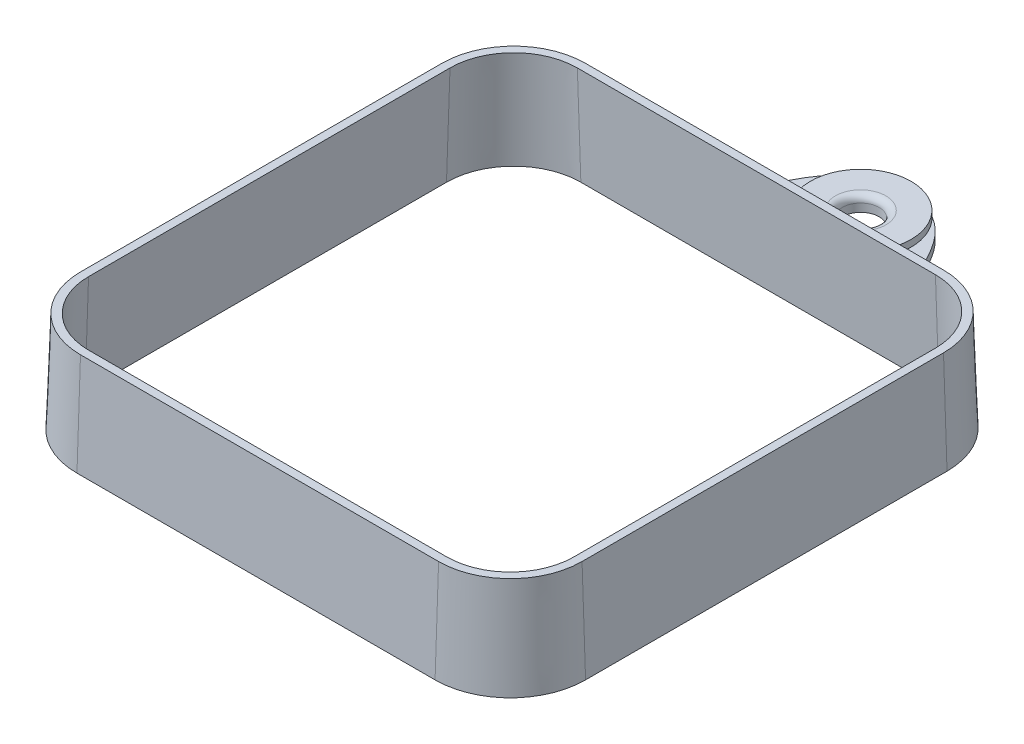
ISO-10303-21;
HEADER;
FILE_DESCRIPTION(('STEP AP214'),'2;1');
FILE_NAME('part.step','',(''),(''),'','','');
FILE_SCHEMA(('AUTOMOTIVE_DESIGN { 1 0 10303 214 1 1 1 1 }'));
ENDSEC;
DATA;
#1=APPLICATION_CONTEXT('core data for automotive mechanical design processes');
#2=APPLICATION_PROTOCOL_DEFINITION('international standard','automotive_design',2000,#1);
#3=PRODUCT_CONTEXT('',#1,'mechanical');
#4=PRODUCT('Part','Part','',(#3));
#5=PRODUCT_RELATED_PRODUCT_CATEGORY('part','',(#4));
#6=PRODUCT_DEFINITION_FORMATION('','',#4);
#7=PRODUCT_DEFINITION_CONTEXT('part definition',#1,'design');
#8=PRODUCT_DEFINITION('design','',#6,#7);
#9=PRODUCT_DEFINITION_SHAPE('','',#8);
#10=(LENGTH_UNIT() NAMED_UNIT(*) SI_UNIT(.MILLI.,.METRE.));
#11=(NAMED_UNIT(*) PLANE_ANGLE_UNIT() SI_UNIT($,.RADIAN.));
#12=(NAMED_UNIT(*) SI_UNIT($,.STERADIAN.) SOLID_ANGLE_UNIT());
#13=UNCERTAINTY_MEASURE_WITH_UNIT(LENGTH_MEASURE(1.E-05),#10,'distance_accuracy_value','');
#14=(GEOMETRIC_REPRESENTATION_CONTEXT(3) GLOBAL_UNCERTAINTY_ASSIGNED_CONTEXT((#13)) GLOBAL_UNIT_ASSIGNED_CONTEXT((#10,
#11,#12)) REPRESENTATION_CONTEXT('',''));
#15=CARTESIAN_POINT('',(0.,0.,0.));
#16=DIRECTION('',(0.,0.,1.));
#17=DIRECTION('',(1.,0.,0.));
#18=AXIS2_PLACEMENT_3D('',#15,#16,#17);
#19=CARTESIAN_POINT('',(0.,0.0418793960430013,-38.0992689924229));
#20=DIRECTION('',(0.,0.034899496702501,-0.999390827019096));
#21=DIRECTION('',(0.,0.999390827019096,0.034899496702501));
#22=AXIS2_PLACEMENT_3D('',#19,#20,#21);
#23=PLANE('',#22);
#24=CARTESIAN_POINT('',(24.3443572866646,5.06040201319,-37.9240183209204));
#25=CARTESIAN_POINT('',(24.292774527979,4.41700375723169,-37.9464862833007));
#26=CARTESIAN_POINT('',(24.2411963246733,3.77360513465057,-37.9689542582177));
#27=CARTESIAN_POINT('',(24.1380743347805,2.48680513734187,-38.0138903040675));
#28=CARTESIAN_POINT('',(24.0865305481931,1.8434037626143,-38.0363583750002));
#29=CARTESIAN_POINT('',(24.0029908254919,0.800001003921938,-38.0727948022396));
#30=CARTESIAN_POINT('',(23.9709765695924,0.400001084917427,-38.0867631072816));
#31=CARTESIAN_POINT('',(23.9389768953499,1.57888888366451E-10,-38.1007314531531));
#32=B_SPLINE_CURVE_WITH_KNOTS('',3,(#24,#25,#26,#27,#28,#29,#30,#31),.UNSPECIFIED.,.F.,.F.,(4,2,
2,4),(0.,1.9375608808805,3.87512175467341,5.07968792201789),.UNSPECIFIED.);
#33=CARTESIAN_POINT('',(24.3443572866646,5.06040201319,-37.9240183209204));
#34=VERTEX_POINT('',#33);
#35=CARTESIAN_POINT('',(23.9389768970062,0.,-38.1007314531586));
#36=VERTEX_POINT('',#35);
#37=EDGE_CURVE('E88',#34,#36,#32,.T.);
#38=ORIENTED_EDGE('',*,*,#37,.F.);
#39=DIRECTION('',(1.,0.,0.));
#40=VECTOR('',#39,1.);
#41=CARTESIAN_POINT('',(-24.035016622755,5.06040201319,-37.9240183209204));
#42=LINE('',#41,#40);
#43=CARTESIAN_POINT('',(-24.3443572866646,5.06040201319,-37.9240183209204));
#44=VERTEX_POINT('',#43);
#45=EDGE_CURVE('E290',#34,#44,#42,.F.);
#46=ORIENTED_EDGE('',*,*,#45,.T.);
#47=CARTESIAN_POINT('',(-24.3443572866646,5.06040201319,-37.9240183209204));
#48=CARTESIAN_POINT('',(-24.2927745279789,4.41700375723169,-37.9464862833007));
#49=CARTESIAN_POINT('',(-24.2411963246733,3.77360513465057,-37.9689542582177));
#50=CARTESIAN_POINT('',(-24.1380743347805,2.48680513734187,-38.0138903040675));
#51=CARTESIAN_POINT('',(-24.0865305481931,1.8434037626143,-38.0363583750002));
#52=CARTESIAN_POINT('',(-24.002990825492,0.800001003921938,-38.0727948022396));
#53=CARTESIAN_POINT('',(-23.9709765695924,0.400001084917427,-38.0867631072816));
#54=CARTESIAN_POINT('',(-23.9389768953499,1.57889464949664E-10,-38.1007314531531));
#55=B_SPLINE_CURVE_WITH_KNOTS('',3,(#47,#48,#49,#50,#51,#52,#53,#54),.UNSPECIFIED.,.F.,.F.,(4,2,
2,4),(0.,1.9375608808805,3.87512175467341,5.07968792201789),.UNSPECIFIED.);
#56=CARTESIAN_POINT('',(-23.9389768970062,0.,-38.1007314531586));
#57=VERTEX_POINT('',#56);
#58=EDGE_CURVE('E96',#44,#57,#55,.T.);
#59=ORIENTED_EDGE('',*,*,#58,.T.);
#60=DIRECTION('',(1.,0.,0.));
#61=VECTOR('',#60,1.);
#62=CARTESIAN_POINT('',(0.,0.,-38.1007314531586));
#63=LINE('',#62,#61);
#64=CARTESIAN_POINT('',(-26.65,0.,-38.1007314531586));
#65=VERTEX_POINT('',#64);
#66=EDGE_CURVE('E473',#65,#57,#63,.T.);
#67=ORIENTED_EDGE('',*,*,#66,.F.);
#68=DIRECTION('',(0.,-0.999390827019096,-0.034899496702501));
#69=VECTOR('',#68,1.);
#70=CARTESIAN_POINT('',(-26.65,0.0418793960430013,-38.0992689924229));
#71=LINE('',#70,#69);
#72=CARTESIAN_POINT('',(-26.65,15.,-37.5769199107824));
#73=VERTEX_POINT('',#72);
#74=EDGE_CURVE('E444',#73,#65,#71,.T.);
#75=ORIENTED_EDGE('',*,*,#74,.F.);
#76=DIRECTION('',(1.,0.,0.));
#77=VECTOR('',#76,1.);
#78=CARTESIAN_POINT('',(0.,15.,-37.5769199107824));
#79=LINE('',#78,#77);
#80=CARTESIAN_POINT('',(26.65,15.,-37.5769199107824));
#81=VERTEX_POINT('',#80);
#82=EDGE_CURVE('E448',#73,#81,#79,.T.);
#83=ORIENTED_EDGE('',*,*,#82,.T.);
#84=DIRECTION('',(0.,0.999390827019096,0.034899496702501));
#85=VECTOR('',#84,1.);
#86=CARTESIAN_POINT('',(26.65,0.0418793960430013,-38.0992689924229));
#87=LINE('',#86,#85);
#88=CARTESIAN_POINT('',(26.65,0.,-38.1007314531586));
#89=VERTEX_POINT('',#88);
#90=EDGE_CURVE('E447',#81,#89,#87,.F.);
#91=ORIENTED_EDGE('',*,*,#90,.T.);
#92=EDGE_CURVE('E477',#36,#89,#63,.T.);
#93=ORIENTED_EDGE('',*,*,#92,.F.);
#94=EDGE_LOOP('',(#38,#46,#59,#67,#75,#83,#91,#93));
#95=FACE_BOUND('',#94,.T.);
#96=ADVANCED_FACE('F72',(#95),#23,.T.);
#97=CARTESIAN_POINT('',(0.,15.,0.));
#98=DIRECTION('',(0.,1.,0.));
#99=DIRECTION('',(0.,0.,1.));
#100=AXIS2_PLACEMENT_3D('',#97,#98,#99);
#101=PLANE('',#100);
#102=CARTESIAN_POINT('',(-26.65,15.,-26.9));
#103=DIRECTION('',(0.,1.,0.));
#104=DIRECTION('',(0.,0.,1.));
#105=AXIS2_PLACEMENT_3D('',#102,#103,#104);
#106=CIRCLE('',#105,10.6769199107824);
#107=CARTESIAN_POINT('',(-37.3269199107824,15.,-26.9));
#108=VERTEX_POINT('',#107);
#109=EDGE_CURVE('E476',#108,#73,#106,.F.);
#110=ORIENTED_EDGE('',*,*,#109,.F.);
#111=DIRECTION('',(0.,0.,-1.));
#112=VECTOR('',#111,1.);
#113=CARTESIAN_POINT('',(-37.3269199107824,15.,0.));
#114=LINE('',#113,#112);
#115=CARTESIAN_POINT('',(-37.3269199107824,15.,26.9));
#116=VERTEX_POINT('',#115);
#117=EDGE_CURVE('E501',#116,#108,#114,.T.);
#118=ORIENTED_EDGE('',*,*,#117,.F.);
#119=CARTESIAN_POINT('',(-26.65,15.,26.9));
#120=DIRECTION('',(0.,1.,0.));
#121=DIRECTION('',(0.,0.,1.));
#122=AXIS2_PLACEMENT_3D('',#119,#120,#121);
#123=CIRCLE('',#122,10.6769199107824);
#124=CARTESIAN_POINT('',(-26.65,15.,37.5769199107824));
#125=VERTEX_POINT('',#124);
#126=EDGE_CURVE('E505',#125,#116,#123,.F.);
#127=ORIENTED_EDGE('',*,*,#126,.F.);
#128=DIRECTION('',(-1.,0.,0.));
#129=VECTOR('',#128,1.);
#130=CARTESIAN_POINT('',(0.,15.,37.5769199107824));
#131=LINE('',#130,#129);
#132=CARTESIAN_POINT('',(26.65,15.,37.5769199107824));
#133=VERTEX_POINT('',#132);
#134=EDGE_CURVE('E509',#125,#133,#131,.F.);
#135=ORIENTED_EDGE('',*,*,#134,.T.);
#136=CARTESIAN_POINT('',(26.65,15.,26.9));
#137=DIRECTION('',(0.,1.,0.));
#138=DIRECTION('',(0.,0.,1.));
#139=AXIS2_PLACEMENT_3D('',#136,#137,#138);
#140=CIRCLE('',#139,10.6769199107824);
#141=CARTESIAN_POINT('',(37.3269199107824,15.,26.9));
#142=VERTEX_POINT('',#141);
#143=EDGE_CURVE('E512',#133,#142,#140,.T.);
#144=ORIENTED_EDGE('',*,*,#143,.T.);
#145=DIRECTION('',(0.,0.,1.));
#146=VECTOR('',#145,1.);
#147=CARTESIAN_POINT('',(37.3269199107824,15.,0.));
#148=LINE('',#147,#146);
#149=CARTESIAN_POINT('',(37.3269199107824,15.,-26.9));
#150=VERTEX_POINT('',#149);
#151=EDGE_CURVE('E515',#142,#150,#148,.F.);
#152=ORIENTED_EDGE('',*,*,#151,.T.);
#153=CARTESIAN_POINT('',(26.65,15.,-26.9));
#154=DIRECTION('',(0.,1.,0.));
#155=DIRECTION('',(0.,0.,1.));
#156=AXIS2_PLACEMENT_3D('',#153,#154,#155);
#157=CIRCLE('',#156,10.6769199107824);
#158=EDGE_CURVE('E518',#150,#81,#157,.T.);
#159=ORIENTED_EDGE('',*,*,#158,.T.);
#160=ORIENTED_EDGE('',*,*,#82,.F.);
#161=EDGE_LOOP('',(#110,#118,#127,#135,#144,#152,#159,#160));
#162=FACE_BOUND('',#161,.T.);
#163=DIRECTION('',(0.,0.,-1.));
#164=VECTOR('',#163,1.);
#165=CARTESIAN_POINT('',(-36.1261884576238,15.,0.));
#166=LINE('',#165,#164);
#167=CARTESIAN_POINT('',(-36.1261884576238,15.,26.9));
#168=VERTEX_POINT('',#167);
#169=CARTESIAN_POINT('',(-36.1261884576238,15.,-26.9));
#170=VERTEX_POINT('',#169);
#171=EDGE_CURVE('E416',#168,#170,#166,.T.);
#172=ORIENTED_EDGE('',*,*,#171,.T.);
#173=CARTESIAN_POINT('',(-26.65,15.,-26.9));
#174=DIRECTION('',(0.,1.,0.));
#175=DIRECTION('',(0.,0.,1.));
#176=AXIS2_PLACEMENT_3D('',#173,#174,#175);
#177=CIRCLE('',#176,9.47618845762378);
#178=CARTESIAN_POINT('',(-26.65,15.,-36.3761884576238));
#179=VERTEX_POINT('',#178);
#180=EDGE_CURVE('E385',#170,#179,#177,.F.);
#181=ORIENTED_EDGE('',*,*,#180,.T.);
#182=DIRECTION('',(1.,0.,0.));
#183=VECTOR('',#182,1.);
#184=CARTESIAN_POINT('',(0.,15.,-36.3761884576238));
#185=LINE('',#184,#183);
#186=CARTESIAN_POINT('',(26.65,15.,-36.3761884576238));
#187=VERTEX_POINT('',#186);
#188=EDGE_CURVE('E395',#179,#187,#185,.T.);
#189=ORIENTED_EDGE('',*,*,#188,.T.);
#190=CARTESIAN_POINT('',(26.65,15.,-26.9));
#191=DIRECTION('',(0.,1.,0.));
#192=DIRECTION('',(0.,0.,1.));
#193=AXIS2_PLACEMENT_3D('',#190,#191,#192);
#194=CIRCLE('',#193,9.47618845762378);
#195=CARTESIAN_POINT('',(36.1261884576238,15.,-26.9));
#196=VERTEX_POINT('',#195);
#197=EDGE_CURVE('E433',#196,#187,#194,.T.);
#198=ORIENTED_EDGE('',*,*,#197,.F.);
#199=DIRECTION('',(0.,0.,1.));
#200=VECTOR('',#199,1.);
#201=CARTESIAN_POINT('',(36.1261884576238,15.,0.));
#202=LINE('',#201,#200);
#203=CARTESIAN_POINT('',(36.1261884576238,15.,26.9));
#204=VERTEX_POINT('',#203);
#205=EDGE_CURVE('E430',#204,#196,#202,.F.);
#206=ORIENTED_EDGE('',*,*,#205,.F.);
#207=CARTESIAN_POINT('',(26.65,15.,26.9));
#208=DIRECTION('',(0.,1.,0.));
#209=DIRECTION('',(0.,0.,1.));
#210=AXIS2_PLACEMENT_3D('',#207,#208,#209);
#211=CIRCLE('',#210,9.47618845762379);
#212=CARTESIAN_POINT('',(26.65,15.,36.3761884576238));
#213=VERTEX_POINT('',#212);
#214=EDGE_CURVE('E427',#213,#204,#211,.T.);
#215=ORIENTED_EDGE('',*,*,#214,.F.);
#216=DIRECTION('',(-1.,0.,0.));
#217=VECTOR('',#216,1.);
#218=CARTESIAN_POINT('',(0.,15.,36.3761884576238));
#219=LINE('',#218,#217);
#220=CARTESIAN_POINT('',(-26.65,15.,36.3761884576238));
#221=VERTEX_POINT('',#220);
#222=EDGE_CURVE('E424',#221,#213,#219,.F.);
#223=ORIENTED_EDGE('',*,*,#222,.F.);
#224=CARTESIAN_POINT('',(-26.65,15.,26.9));
#225=DIRECTION('',(0.,1.,0.));
#226=DIRECTION('',(0.,0.,1.));
#227=AXIS2_PLACEMENT_3D('',#224,#225,#226);
#228=CIRCLE('',#227,9.47618845762379);
#229=EDGE_CURVE('E420',#221,#168,#228,.F.);
#230=ORIENTED_EDGE('',*,*,#229,.T.);
#231=EDGE_LOOP('',(#172,#181,#189,#198,#206,#215,#223,#230));
#232=FACE_BOUND('',#231,.T.);
#233=ADVANCED_FACE('F305',(#162,#232),#101,.T.);
#234=CARTESIAN_POINT('',(0.,0.,0.));
#235=DIRECTION('',(0.,1.,0.));
#236=DIRECTION('',(0.,0.,1.));
#237=AXIS2_PLACEMENT_3D('',#234,#235,#236);
#238=PLANE('',#237);
#239=CARTESIAN_POINT('',(0.,0.,-51.9));
#240=DIRECTION('',(0.,1.,0.));
#241=DIRECTION('',(0.,0.,1.));
#242=AXIS2_PLACEMENT_3D('',#239,#240,#241);
#243=CIRCLE('',#242,2.75);
#244=CARTESIAN_POINT('',(0.,0.,-49.15));
#245=VERTEX_POINT('',#244);
#246=EDGE_CURVE('E339',#245,#245,#243,.T.);
#247=ORIENTED_EDGE('',*,*,#246,.T.);
#248=EDGE_LOOP('',(#247));
#249=FACE_BOUND('',#248,.T.);
#250=CARTESIAN_POINT('',(-5.0383215447343,0.,-57.4556562179338));
#251=CARTESIAN_POINT('',(-10.1990234495818,0.,-54.5143425507522));
#252=CARTESIAN_POINT('',(-11.6345470296447,0.,-42.5074220737766));
#253=CARTESIAN_POINT('',(-22.76873524879,0.,-38.6972857674965));
#254=CARTESIAN_POINT('',(-26.65,0.,-36.9));
#255=B_SPLINE_CURVE_WITH_KNOTS('',3,(#250,#251,#252,#253,#254),.UNSPECIFIED.,.F.,.F.,(4,1,4),
(0.,0.548123210372477,1.),.UNSPECIFIED.);
#256=CARTESIAN_POINT('',(-5.03832154473429,0.,-57.4556562179338));
#257=VERTEX_POINT('',#256);
#258=EDGE_CURVE('E255',#257,#57,#255,.T.);
#259=ORIENTED_EDGE('',*,*,#258,.F.);
#260=CARTESIAN_POINT('',(0.,0.,-51.9));
#261=DIRECTION('',(0.,1.,0.));
#262=DIRECTION('',(0.,0.,1.));
#263=AXIS2_PLACEMENT_3D('',#260,#261,#262);
#264=CIRCLE('',#263,7.5);
#265=CARTESIAN_POINT('',(5.03832154473429,0.,-57.4556562179338));
#266=VERTEX_POINT('',#265);
#267=EDGE_CURVE('E346',#266,#257,#264,.T.);
#268=ORIENTED_EDGE('',*,*,#267,.F.);
#269=CARTESIAN_POINT('',(5.0383215447343,0.,-57.4556562179338));
#270=CARTESIAN_POINT('',(10.1990234495818,0.,-54.5143425507522));
#271=CARTESIAN_POINT('',(11.6345470296447,0.,-42.5074220737765));
#272=CARTESIAN_POINT('',(22.76873524879,0.,-38.6972857674965));
#273=CARTESIAN_POINT('',(26.65,0.,-36.9));
#274=B_SPLINE_CURVE_WITH_KNOTS('',3,(#269,#270,#271,#272,#273),.UNSPECIFIED.,.F.,.F.,(4,1,4),
(0.,0.548123210372477,1.),.UNSPECIFIED.);
#275=EDGE_CURVE('E236',#266,#36,#274,.T.);
#276=ORIENTED_EDGE('',*,*,#275,.T.);
#277=ORIENTED_EDGE('',*,*,#92,.T.);
#278=CARTESIAN_POINT('',(26.65,0.,-26.9));
#279=DIRECTION('',(0.,1.,0.));
#280=DIRECTION('',(0.,0.,1.));
#281=AXIS2_PLACEMENT_3D('',#278,#279,#280);
#282=CIRCLE('',#281,11.2007314531586);
#283=CARTESIAN_POINT('',(37.8507314531586,0.,-26.9));
#284=VERTEX_POINT('',#283);
#285=EDGE_CURVE('E478',#284,#89,#282,.T.);
#286=ORIENTED_EDGE('',*,*,#285,.F.);
#287=DIRECTION('',(0.,0.,1.));
#288=VECTOR('',#287,1.);
#289=CARTESIAN_POINT('',(37.8507314531586,0.,0.));
#290=LINE('',#289,#288);
#291=CARTESIAN_POINT('',(37.8507314531586,0.,26.9));
#292=VERTEX_POINT('',#291);
#293=EDGE_CURVE('E482',#292,#284,#290,.F.);
#294=ORIENTED_EDGE('',*,*,#293,.F.);
#295=CARTESIAN_POINT('',(26.65,0.,26.9));
#296=DIRECTION('',(0.,1.,0.));
#297=DIRECTION('',(0.,0.,1.));
#298=AXIS2_PLACEMENT_3D('',#295,#296,#297);
#299=CIRCLE('',#298,11.2007314531586);
#300=CARTESIAN_POINT('',(26.65,0.,38.1007314531586));
#301=VERTEX_POINT('',#300);
#302=EDGE_CURVE('E485',#301,#292,#299,.T.);
#303=ORIENTED_EDGE('',*,*,#302,.F.);
#304=DIRECTION('',(-1.,0.,0.));
#305=VECTOR('',#304,1.);
#306=CARTESIAN_POINT('',(0.,0.,38.1007314531586));
#307=LINE('',#306,#305);
#308=CARTESIAN_POINT('',(-26.65,0.,38.1007314531586));
#309=VERTEX_POINT('',#308);
#310=EDGE_CURVE('E488',#309,#301,#307,.F.);
#311=ORIENTED_EDGE('',*,*,#310,.F.);
#312=CARTESIAN_POINT('',(-26.65,0.,26.9));
#313=DIRECTION('',(0.,1.,0.));
#314=DIRECTION('',(0.,0.,1.));
#315=AXIS2_PLACEMENT_3D('',#312,#313,#314);
#316=CIRCLE('',#315,11.2007314531586);
#317=CARTESIAN_POINT('',(-37.8507314531586,0.,26.9));
#318=VERTEX_POINT('',#317);
#319=EDGE_CURVE('E491',#309,#318,#316,.F.);
#320=ORIENTED_EDGE('',*,*,#319,.T.);
#321=DIRECTION('',(0.,0.,-1.));
#322=VECTOR('',#321,1.);
#323=CARTESIAN_POINT('',(-37.8507314531586,0.,0.));
#324=LINE('',#323,#322);
#325=CARTESIAN_POINT('',(-37.8507314531586,0.,-26.9));
#326=VERTEX_POINT('',#325);
#327=EDGE_CURVE('E472',#318,#326,#324,.T.);
#328=ORIENTED_EDGE('',*,*,#327,.T.);
#329=CARTESIAN_POINT('',(-26.65,0.,-26.9));
#330=DIRECTION('',(0.,1.,0.));
#331=DIRECTION('',(0.,0.,1.));
#332=AXIS2_PLACEMENT_3D('',#329,#330,#331);
#333=CIRCLE('',#332,11.2007314531586);
#334=EDGE_CURVE('E389',#326,#65,#333,.F.);
#335=ORIENTED_EDGE('',*,*,#334,.T.);
#336=ORIENTED_EDGE('',*,*,#66,.T.);
#337=EDGE_LOOP('',(#259,#268,#276,#277,#286,#294,#303,#311,#320,#328,#335,#336));
#338=FACE_BOUND('',#337,.T.);
#339=DIRECTION('',(1.,0.,0.));
#340=VECTOR('',#339,1.);
#341=CARTESIAN_POINT('',(0.,0.,-36.9));
#342=LINE('',#341,#340);
#343=CARTESIAN_POINT('',(-26.65,0.,-36.9));
#344=VERTEX_POINT('',#343);
#345=CARTESIAN_POINT('',(26.65,0.,-36.9));
#346=VERTEX_POINT('',#345);
#347=EDGE_CURVE('E381',#344,#346,#342,.T.);
#348=ORIENTED_EDGE('',*,*,#347,.F.);
#349=CARTESIAN_POINT('',(-26.65,0.,-26.9));
#350=DIRECTION('',(0.,1.,0.));
#351=DIRECTION('',(0.,0.,1.));
#352=AXIS2_PLACEMENT_3D('',#349,#350,#351);
#353=CIRCLE('',#352,10.);
#354=CARTESIAN_POINT('',(-36.65,0.,-26.9));
#355=VERTEX_POINT('',#354);
#356=EDGE_CURVE('E354',#355,#344,#353,.F.);
#357=ORIENTED_EDGE('',*,*,#356,.F.);
#358=DIRECTION('',(0.,0.,-1.));
#359=VECTOR('',#358,1.);
#360=CARTESIAN_POINT('',(-36.65,0.,0.));
#361=LINE('',#360,#359);
#362=CARTESIAN_POINT('',(-36.65,0.,26.9));
#363=VERTEX_POINT('',#362);
#364=EDGE_CURVE('E358',#363,#355,#361,.T.);
#365=ORIENTED_EDGE('',*,*,#364,.F.);
#366=CARTESIAN_POINT('',(-26.65,0.,26.9));
#367=DIRECTION('',(0.,1.,0.));
#368=DIRECTION('',(0.,0.,1.));
#369=AXIS2_PLACEMENT_3D('',#366,#367,#368);
#370=CIRCLE('',#369,10.);
#371=CARTESIAN_POINT('',(-26.65,0.,36.9));
#372=VERTEX_POINT('',#371);
#373=EDGE_CURVE('E362',#372,#363,#370,.F.);
#374=ORIENTED_EDGE('',*,*,#373,.F.);
#375=DIRECTION('',(1.,0.,0.));
#376=VECTOR('',#375,1.);
#377=CARTESIAN_POINT('',(0.,0.,36.9));
#378=LINE('',#377,#376);
#379=CARTESIAN_POINT('',(26.65,0.,36.9));
#380=VERTEX_POINT('',#379);
#381=EDGE_CURVE('E365',#372,#380,#378,.T.);
#382=ORIENTED_EDGE('',*,*,#381,.T.);
#383=CARTESIAN_POINT('',(26.65,0.,26.9));
#384=DIRECTION('',(0.,1.,0.));
#385=DIRECTION('',(0.,0.,1.));
#386=AXIS2_PLACEMENT_3D('',#383,#384,#385);
#387=CIRCLE('',#386,10.);
#388=CARTESIAN_POINT('',(36.65,0.,26.9));
#389=VERTEX_POINT('',#388);
#390=EDGE_CURVE('E369',#380,#389,#387,.T.);
#391=ORIENTED_EDGE('',*,*,#390,.T.);
#392=DIRECTION('',(0.,0.,-1.));
#393=VECTOR('',#392,1.);
#394=CARTESIAN_POINT('',(36.65,0.,0.));
#395=LINE('',#394,#393);
#396=CARTESIAN_POINT('',(36.65,0.,-26.9));
#397=VERTEX_POINT('',#396);
#398=EDGE_CURVE('E373',#389,#397,#395,.T.);
#399=ORIENTED_EDGE('',*,*,#398,.T.);
#400=CARTESIAN_POINT('',(26.65,0.,-26.9));
#401=DIRECTION('',(0.,1.,0.));
#402=DIRECTION('',(0.,0.,1.));
#403=AXIS2_PLACEMENT_3D('',#400,#401,#402);
#404=CIRCLE('',#403,10.);
#405=EDGE_CURVE('E377',#397,#346,#404,.T.);
#406=ORIENTED_EDGE('',*,*,#405,.T.);
#407=EDGE_LOOP('',(#348,#357,#365,#374,#382,#391,#399,#406));
#408=FACE_BOUND('',#407,.T.);
#409=ADVANCED_FACE('F535',(#249,#338,#408),#238,.F.);
#410=CARTESIAN_POINT('',(-26.65,0.0418793960430013,-26.9));
#411=DIRECTION('',(0.,-1.,0.));
#412=DIRECTION('',(0.,0.,1.));
#413=AXIS2_PLACEMENT_3D('',#410,#411,#412);
#414=CONICAL_SURFACE('',#413,11.1992689924229,0.0349065850398867);
#415=ORIENTED_EDGE('',*,*,#334,.F.);
#416=DIRECTION('',(-0.034899496702501,-0.999390827019096,0.));
#417=VECTOR('',#416,1.);
#418=CARTESIAN_POINT('',(-37.8492689924229,0.0418793960430007,-26.9));
#419=LINE('',#418,#417);
#420=EDGE_CURVE('E440',#108,#326,#419,.T.);
#421=ORIENTED_EDGE('',*,*,#420,.F.);
#422=ORIENTED_EDGE('',*,*,#109,.T.);
#423=ORIENTED_EDGE('',*,*,#74,.T.);
#424=EDGE_LOOP('',(#415,#421,#422,#423));
#425=FACE_BOUND('',#424,.T.);
#426=ADVANCED_FACE('F543',(#425),#414,.T.);
#427=CARTESIAN_POINT('',(-37.8492689924229,0.0418793960430013,0.));
#428=DIRECTION('',(-0.999390827019096,0.034899496702501,0.));
#429=DIRECTION('',(-0.034899496702501,-0.999390827019096,0.));
#430=AXIS2_PLACEMENT_3D('',#427,#428,#429);
#431=PLANE('',#430);
#432=ORIENTED_EDGE('',*,*,#327,.F.);
#433=DIRECTION('',(-0.034899496702501,-0.999390827019096,0.));
#434=VECTOR('',#433,1.);
#435=CARTESIAN_POINT('',(-37.8492689924229,0.0418793960430013,26.9));
#436=LINE('',#435,#434);
#437=EDGE_CURVE('E443',#116,#318,#436,.T.);
#438=ORIENTED_EDGE('',*,*,#437,.F.);
#439=ORIENTED_EDGE('',*,*,#117,.T.);
#440=ORIENTED_EDGE('',*,*,#420,.T.);
#441=EDGE_LOOP('',(#432,#438,#439,#440));
#442=FACE_BOUND('',#441,.T.);
#443=ADVANCED_FACE('F545',(#442),#431,.T.);
#444=CARTESIAN_POINT('',(-26.65,0.0418793960430013,26.9));
#445=DIRECTION('',(0.,-1.,0.));
#446=DIRECTION('',(0.,0.,1.));
#447=AXIS2_PLACEMENT_3D('',#444,#445,#446);
#448=CONICAL_SURFACE('',#447,11.1992689924229,0.0349065850398867);
#449=ORIENTED_EDGE('',*,*,#319,.F.);
#450=DIRECTION('',(0.,-0.999390827019096,0.034899496702501));
#451=VECTOR('',#450,1.);
#452=CARTESIAN_POINT('',(-26.65,0.0418793960430013,38.0992689924229));
#453=LINE('',#452,#451);
#454=EDGE_CURVE('E451',#125,#309,#453,.T.);
#455=ORIENTED_EDGE('',*,*,#454,.F.);
#456=ORIENTED_EDGE('',*,*,#126,.T.);
#457=ORIENTED_EDGE('',*,*,#437,.T.);
#458=EDGE_LOOP('',(#449,#455,#456,#457));
#459=FACE_BOUND('',#458,.T.);
#460=ADVANCED_FACE('F549',(#459),#448,.T.);
#461=CARTESIAN_POINT('',(0.,0.0418793960430013,38.0992689924229));
#462=DIRECTION('',(0.,0.034899496702501,0.999390827019096));
#463=DIRECTION('',(0.,-0.999390827019096,0.034899496702501));
#464=AXIS2_PLACEMENT_3D('',#461,#462,#463);
#465=PLANE('',#464);
#466=ORIENTED_EDGE('',*,*,#310,.T.);
#467=DIRECTION('',(0.,-0.999390827019096,0.034899496702501));
#468=VECTOR('',#467,1.);
#469=CARTESIAN_POINT('',(26.65,0.0418793960430013,38.0992689924229));
#470=LINE('',#469,#468);
#471=EDGE_CURVE('E454',#133,#301,#470,.T.);
#472=ORIENTED_EDGE('',*,*,#471,.F.);
#473=ORIENTED_EDGE('',*,*,#134,.F.);
#474=ORIENTED_EDGE('',*,*,#454,.T.);
#475=EDGE_LOOP('',(#466,#472,#473,#474));
#476=FACE_BOUND('',#475,.T.);
#477=ADVANCED_FACE('F554',(#476),#465,.T.);
#478=CARTESIAN_POINT('',(26.65,0.0418793960430013,26.9));
#479=DIRECTION('',(0.,-1.,0.));
#480=DIRECTION('',(0.,0.,1.));
#481=AXIS2_PLACEMENT_3D('',#478,#479,#480);
#482=CONICAL_SURFACE('',#481,11.1992689924229,0.0349065850398867);
#483=ORIENTED_EDGE('',*,*,#302,.T.);
#484=DIRECTION('',(-0.034899496702501,0.999390827019096,0.));
#485=VECTOR('',#484,1.);
#486=CARTESIAN_POINT('',(37.8492689924229,0.0418793960430019,26.9));
#487=LINE('',#486,#485);
#488=EDGE_CURVE('E458',#142,#292,#487,.F.);
#489=ORIENTED_EDGE('',*,*,#488,.F.);
#490=ORIENTED_EDGE('',*,*,#143,.F.);
#491=ORIENTED_EDGE('',*,*,#471,.T.);
#492=EDGE_LOOP('',(#483,#489,#490,#491));
#493=FACE_BOUND('',#492,.T.);
#494=ADVANCED_FACE('F558',(#493),#482,.T.);
#495=CARTESIAN_POINT('',(37.8492689924229,0.0418793960430013,0.));
#496=DIRECTION('',(0.999390827019096,0.034899496702501,0.));
#497=DIRECTION('',(-0.034899496702501,0.999390827019096,0.));
#498=AXIS2_PLACEMENT_3D('',#495,#496,#497);
#499=PLANE('',#498);
#500=ORIENTED_EDGE('',*,*,#293,.T.);
#501=DIRECTION('',(0.034899496702501,-0.999390827019096,0.));
#502=VECTOR('',#501,1.);
#503=CARTESIAN_POINT('',(37.8492689924229,0.0418793960430013,-26.9));
#504=LINE('',#503,#502);
#505=EDGE_CURVE('E462',#150,#284,#504,.T.);
#506=ORIENTED_EDGE('',*,*,#505,.F.);
#507=ORIENTED_EDGE('',*,*,#151,.F.);
#508=ORIENTED_EDGE('',*,*,#488,.T.);
#509=EDGE_LOOP('',(#500,#506,#507,#508));
#510=FACE_BOUND('',#509,.T.);
#511=ADVANCED_FACE('F560',(#510),#499,.T.);
#512=CARTESIAN_POINT('',(26.65,0.0418793960430013,-26.9));
#513=DIRECTION('',(0.,-1.,0.));
#514=DIRECTION('',(0.,0.,1.));
#515=AXIS2_PLACEMENT_3D('',#512,#513,#514);
#516=CONICAL_SURFACE('',#515,11.1992689924229,0.0349065850398867);
#517=ORIENTED_EDGE('',*,*,#285,.T.);
#518=ORIENTED_EDGE('',*,*,#90,.F.);
#519=ORIENTED_EDGE('',*,*,#158,.F.);
#520=ORIENTED_EDGE('',*,*,#505,.T.);
#521=EDGE_LOOP('',(#517,#518,#519,#520));
#522=FACE_BOUND('',#521,.T.);
#523=ADVANCED_FACE('F306',(#522),#516,.T.);
#524=CARTESIAN_POINT('',(-26.65,0.,-26.9));
#525=DIRECTION('',(0.,-1.,0.));
#526=DIRECTION('',(0.,0.,1.));
#527=AXIS2_PLACEMENT_3D('',#524,#525,#526);
#528=CONICAL_SURFACE('',#527,10.,0.0349065850398867);
#529=ORIENTED_EDGE('',*,*,#356,.T.);
#530=DIRECTION('',(0.,-0.999390827019096,-0.034899496702501));
#531=VECTOR('',#530,1.);
#532=CARTESIAN_POINT('',(-26.65,0.,-36.9));
#533=LINE('',#532,#531);
#534=EDGE_CURVE('E391',#179,#344,#533,.T.);
#535=ORIENTED_EDGE('',*,*,#534,.F.);
#536=ORIENTED_EDGE('',*,*,#180,.F.);
#537=DIRECTION('',(-0.034899496702501,-0.999390827019096,0.));
#538=VECTOR('',#537,1.);
#539=CARTESIAN_POINT('',(-36.65,0.,-26.9));
#540=LINE('',#539,#538);
#541=EDGE_CURVE('E386',#170,#355,#540,.T.);
#542=ORIENTED_EDGE('',*,*,#541,.T.);
#543=EDGE_LOOP('',(#529,#535,#536,#542));
#544=FACE_BOUND('',#543,.T.);
#545=ADVANCED_FACE('F566',(#544),#528,.F.);
#546=CARTESIAN_POINT('',(-36.65,0.,0.));
#547=DIRECTION('',(-0.999390827019096,0.034899496702501,0.));
#548=DIRECTION('',(-0.034899496702501,-0.999390827019096,0.));
#549=AXIS2_PLACEMENT_3D('',#546,#547,#548);
#550=PLANE('',#549);
#551=ORIENTED_EDGE('',*,*,#364,.T.);
#552=ORIENTED_EDGE('',*,*,#541,.F.);
#553=ORIENTED_EDGE('',*,*,#171,.F.);
#554=DIRECTION('',(-0.034899496702501,-0.999390827019096,0.));
#555=VECTOR('',#554,1.);
#556=CARTESIAN_POINT('',(-36.65,0.,26.9));
#557=LINE('',#556,#555);
#558=EDGE_CURVE('E390',#168,#363,#557,.T.);
#559=ORIENTED_EDGE('',*,*,#558,.T.);
#560=EDGE_LOOP('',(#551,#552,#553,#559));
#561=FACE_BOUND('',#560,.T.);
#562=ADVANCED_FACE('F581',(#561),#550,.F.);
#563=CARTESIAN_POINT('',(-26.65,0.,26.9));
#564=DIRECTION('',(0.,-1.,0.));
#565=DIRECTION('',(0.,0.,1.));
#566=AXIS2_PLACEMENT_3D('',#563,#564,#565);
#567=CONICAL_SURFACE('',#566,10.,0.0349065850398867);
#568=ORIENTED_EDGE('',*,*,#373,.T.);
#569=ORIENTED_EDGE('',*,*,#558,.F.);
#570=ORIENTED_EDGE('',*,*,#229,.F.);
#571=DIRECTION('',(0.,-0.999390827019096,0.034899496702501));
#572=VECTOR('',#571,1.);
#573=CARTESIAN_POINT('',(-26.65,0.,36.9));
#574=LINE('',#573,#572);
#575=EDGE_CURVE('E407',#221,#372,#574,.T.);
#576=ORIENTED_EDGE('',*,*,#575,.T.);
#577=EDGE_LOOP('',(#568,#569,#570,#576));
#578=FACE_BOUND('',#577,.T.);
#579=ADVANCED_FACE('F584',(#578),#567,.F.);
#580=CARTESIAN_POINT('',(0.,0.,36.9));
#581=DIRECTION('',(0.,0.034899496702501,0.999390827019096));
#582=DIRECTION('',(0.,-0.999390827019096,0.034899496702501));
#583=AXIS2_PLACEMENT_3D('',#580,#581,#582);
#584=PLANE('',#583);
#585=ORIENTED_EDGE('',*,*,#381,.F.);
#586=ORIENTED_EDGE('',*,*,#575,.F.);
#587=ORIENTED_EDGE('',*,*,#222,.T.);
#588=DIRECTION('',(0.,-0.999390827019096,0.034899496702501));
#589=VECTOR('',#588,1.);
#590=CARTESIAN_POINT('',(26.65,0.,36.9));
#591=LINE('',#590,#589);
#592=EDGE_CURVE('E404',#213,#380,#591,.T.);
#593=ORIENTED_EDGE('',*,*,#592,.T.);
#594=EDGE_LOOP('',(#585,#586,#587,#593));
#595=FACE_BOUND('',#594,.T.);
#596=ADVANCED_FACE('F588',(#595),#584,.F.);
#597=CARTESIAN_POINT('',(26.65,0.,26.9));
#598=DIRECTION('',(0.,-1.,0.));
#599=DIRECTION('',(0.,0.,1.));
#600=AXIS2_PLACEMENT_3D('',#597,#598,#599);
#601=CONICAL_SURFACE('',#600,10.,0.0349065850398867);
#602=ORIENTED_EDGE('',*,*,#390,.F.);
#603=ORIENTED_EDGE('',*,*,#592,.F.);
#604=ORIENTED_EDGE('',*,*,#214,.T.);
#605=DIRECTION('',(0.034899496702501,-0.999390827019096,0.));
#606=VECTOR('',#605,1.);
#607=CARTESIAN_POINT('',(36.65,0.,26.9));
#608=LINE('',#607,#606);
#609=EDGE_CURVE('E401',#204,#389,#608,.T.);
#610=ORIENTED_EDGE('',*,*,#609,.T.);
#611=EDGE_LOOP('',(#602,#603,#604,#610));
#612=FACE_BOUND('',#611,.T.);
#613=ADVANCED_FACE('F592',(#612),#601,.F.);
#614=CARTESIAN_POINT('',(36.65,0.,0.));
#615=DIRECTION('',(0.999390827019096,0.034899496702501,0.));
#616=DIRECTION('',(-0.034899496702501,0.999390827019096,0.));
#617=AXIS2_PLACEMENT_3D('',#614,#615,#616);
#618=PLANE('',#617);
#619=ORIENTED_EDGE('',*,*,#398,.F.);
#620=ORIENTED_EDGE('',*,*,#609,.F.);
#621=ORIENTED_EDGE('',*,*,#205,.T.);
#622=DIRECTION('',(0.034899496702501,-0.999390827019096,0.));
#623=VECTOR('',#622,1.);
#624=CARTESIAN_POINT('',(36.65,0.,-26.9));
#625=LINE('',#624,#623);
#626=EDGE_CURVE('E398',#196,#397,#625,.T.);
#627=ORIENTED_EDGE('',*,*,#626,.T.);
#628=EDGE_LOOP('',(#619,#620,#621,#627));
#629=FACE_BOUND('',#628,.T.);
#630=ADVANCED_FACE('F596',(#629),#618,.F.);
#631=CARTESIAN_POINT('',(26.65,0.,-26.9));
#632=DIRECTION('',(0.,-1.,0.));
#633=DIRECTION('',(0.,0.,1.));
#634=AXIS2_PLACEMENT_3D('',#631,#632,#633);
#635=CONICAL_SURFACE('',#634,10.,0.0349065850398867);
#636=ORIENTED_EDGE('',*,*,#405,.F.);
#637=ORIENTED_EDGE('',*,*,#626,.F.);
#638=ORIENTED_EDGE('',*,*,#197,.T.);
#639=DIRECTION('',(0.,-0.999390827019096,-0.034899496702501));
#640=VECTOR('',#639,1.);
#641=CARTESIAN_POINT('',(26.65,0.,-36.9));
#642=LINE('',#641,#640);
#643=EDGE_CURVE('E394',#187,#346,#642,.T.);
#644=ORIENTED_EDGE('',*,*,#643,.T.);
#645=EDGE_LOOP('',(#636,#637,#638,#644));
#646=FACE_BOUND('',#645,.T.);
#647=ADVANCED_FACE('F600',(#646),#635,.F.);
#648=CARTESIAN_POINT('',(0.,0.,-36.9));
#649=DIRECTION('',(0.,0.034899496702501,-0.999390827019096));
#650=DIRECTION('',(0.,0.999390827019096,0.034899496702501));
#651=AXIS2_PLACEMENT_3D('',#648,#649,#650);
#652=PLANE('',#651);
#653=ORIENTED_EDGE('',*,*,#347,.T.);
#654=ORIENTED_EDGE('',*,*,#643,.F.);
#655=ORIENTED_EDGE('',*,*,#188,.F.);
#656=ORIENTED_EDGE('',*,*,#534,.T.);
#657=EDGE_LOOP('',(#653,#654,#655,#656));
#658=FACE_BOUND('',#657,.T.);
#659=ADVANCED_FACE('F604',(#658),#652,.F.);
#660=CARTESIAN_POINT('',(-5.0383215447343,1.2,-57.4556562179338));
#661=CARTESIAN_POINT('',(-10.1990234495818,1.2,-54.5143425507522));
#662=CARTESIAN_POINT('',(-11.6345470296447,1.2,-42.5074220737766));
#663=CARTESIAN_POINT('',(-22.76873524879,1.2,-38.6972857674965));
#664=CARTESIAN_POINT('',(-26.65,1.2,-36.9));
#665=B_SPLINE_CURVE_WITH_KNOTS('',3,(#660,#661,#662,#663,#664),.UNSPECIFIED.,.F.,.F.,(4,1,4),
(0.,0.548123210372477,1.),.UNSPECIFIED.);
#666=DIRECTION('',(0.,-1.,0.));
#667=VECTOR('',#666,1.);
#668=SURFACE_OF_LINEAR_EXTRUSION('',#665,#667);
#669=ORIENTED_EDGE('',*,*,#58,.F.);
#670=CARTESIAN_POINT('',(-24.3443572866646,5.06040201319,-37.9240183209204));
#671=CARTESIAN_POINT('',(-24.340107648921,5.0071066997797,-37.9258693912185));
#672=CARTESIAN_POINT('',(-24.3333839881674,4.95407607943808,-37.9287980027398));
#673=CARTESIAN_POINT('',(-24.3153286908889,4.84904876165219,-37.9366625703046));
#674=CARTESIAN_POINT('',(-24.304005189336,4.79705040801993,-37.9415949825607));
#675=CARTESIAN_POINT('',(-24.2772565854058,4.69510120995463,-37.9532469662998));
#676=CARTESIAN_POINT('',(-24.2618894989544,4.64513211699835,-37.9599412592231));
#677=CARTESIAN_POINT('',(-24.2273959810717,4.54675637161531,-37.9749689313341));
#678=CARTESIAN_POINT('',(-24.2082676099357,4.49835054042602,-37.9833031562407));
#679=CARTESIAN_POINT('',(-24.1324903207779,4.32518822446093,-38.0163235688535));
#680=CARTESIAN_POINT('',(-24.0657947027834,4.20553748705906,-38.0453941148683));
#681=CARTESIAN_POINT('',(-23.9536271277334,4.03565298712542,-38.0943342818151));
#682=CARTESIAN_POINT('',(-23.9140545937747,3.98044433226548,-38.1116078023769));
#683=CARTESIAN_POINT('',(-23.8315407400799,3.87310984705803,-38.1476505453313));
#684=CARTESIAN_POINT('',(-23.78860022509,3.82098328546362,-38.1664194104429));
#685=CARTESIAN_POINT('',(-23.6648160329163,3.67946526972377,-38.2205737364562));
#686=CARTESIAN_POINT('',(-23.5809083674144,3.59328763463394,-38.257337678273));
#687=CARTESIAN_POINT('',(-23.4067380374233,3.4290367749706,-38.3338391208931));
#688=CARTESIAN_POINT('',(-23.3164700340605,3.35097049841825,-38.3735791216043));
#689=CARTESIAN_POINT('',(-23.1311749533971,3.20174382519932,-38.4554275272407));
#690=CARTESIAN_POINT('',(-23.0361401505568,3.13059522672586,-38.4975397914334));
#691=CARTESIAN_POINT('',(-22.842677377714,2.9944201252315,-38.5836336511419));
#692=CARTESIAN_POINT('',(-22.7442503468488,2.92939194608176,-38.6276147300499));
#693=CARTESIAN_POINT('',(-22.4926718858724,2.77200625691893,-38.7406142845138));
#694=CARTESIAN_POINT('',(-22.337818122577,2.68313912390163,-38.8106990089056));
#695=CARTESIAN_POINT('',(-22.0240626240934,2.51550915086434,-38.9541470313463));
#696=CARTESIAN_POINT('',(-21.8651571125481,2.43675618335615,-39.0275134399173));
#697=CARTESIAN_POINT('',(-21.5446745670716,2.2879309843368,-39.1773145802869));
#698=CARTESIAN_POINT('',(-21.3830964380053,2.21786241650977,-39.2537505891741));
#699=CARTESIAN_POINT('',(-21.0579884425869,2.08529180776038,-39.4097918715609));
#700=CARTESIAN_POINT('',(-20.8944556088869,2.02280348679923,-39.4894025551192));
#701=CARTESIAN_POINT('',(-20.5665242696577,1.90487736086405,-39.6517308437018));
#702=CARTESIAN_POINT('',(-20.4021262868892,1.84943571589891,-39.7344467244792));
#703=CARTESIAN_POINT('',(-20.0729395997366,1.74513951172268,-39.9032208828787));
#704=CARTESIAN_POINT('',(-19.9081508662286,1.69628546028389,-39.9892794174951));
#705=CARTESIAN_POINT('',(-19.6170318199576,1.61560901998993,-40.1445316270751));
#706=CARTESIAN_POINT('',(-19.4906731412358,1.5824684346815,-40.2129911317156));
#707=CARTESIAN_POINT('',(-19.2382385438009,1.5199612592825,-40.3521441171481));
#708=CARTESIAN_POINT('',(-19.1121626439766,1.49059491433263,-40.4228377426773));
#709=CARTESIAN_POINT('',(-18.8605397806821,1.43571140996357,-40.5665731010346));
#710=CARTESIAN_POINT('',(-18.7349927323151,1.4101936079141,-40.6396144393648));
#711=CARTESIAN_POINT('',(-18.4846637028376,1.36314590353003,-40.7881710442855));
#712=CARTESIAN_POINT('',(-18.3598815130177,1.34161486177288,-40.8636855967437));
#713=CARTESIAN_POINT('',(-18.1122689137921,1.30289441828506,-41.0167336435651));
#714=CARTESIAN_POINT('',(-17.9894308738014,1.2856719243084,-41.0942463653078));
#715=CARTESIAN_POINT('',(-17.7449510999419,1.2556256779218,-41.2519878285492));
#716=CARTESIAN_POINT('',(-17.623309441501,1.2428022011505,-41.3322167398959));
#717=CARTESIAN_POINT('',(-17.381445317912,1.22189984913486,-41.4955419381614));
#718=CARTESIAN_POINT('',(-17.2612236591272,1.21382355360765,-41.5786397581862));
#719=CARTESIAN_POINT('',(-17.0224334377779,1.20287817532884,-41.747852777507));
#720=CARTESIAN_POINT('',(-16.9038674209802,1.20001638745739,-41.8339720323795));
#721=CARTESIAN_POINT('',(-16.7863813083872,1.2,-41.9215816289565));
#722=B_SPLINE_CURVE_WITH_KNOTS('',3,(#670,#671,#672,#673,#674,#675,#676,#677,#678,#679,#680,
#681,#682,#683,#684,#685,#686,#687,#688,#689,#690,#691,#692,#693,#694,#695,#696,#697,#698,#699,
#700,#701,#702,#703,#704,#705,#706,#707,#708,#709,#710,#711,#712,#713,#714,#715,#716,#717,#718,
#719,#720,#721),.UNSPECIFIED.,.F.,.F.,(4,2,2,2,2,2,2,2,2,2,2,2,2,2,2,2,2,2,2,2,2,2,2,2,2,4),(0.,
0.160377785814866,0.320473164498309,0.47838617230619,0.636380830874556,1.05373282220967,
1.26390958066844,1.47403627154374,1.85072464972575,2.2277330764722,2.6053736140388,
2.98291042876715,3.55786674376647,4.13338008004798,4.70913538741633,5.2859177150489,
5.86238437291128,6.43889543950606,6.88128683441837,7.32370694858868,7.76605310539293,
8.2082726431527,8.64698349858836,9.08572183825027,9.52469837756464,9.96428855675427),.UNSPECIFIED.);
#723=CARTESIAN_POINT('',(-16.7863813083924,1.2,-41.9215816289526));
#724=VERTEX_POINT('',#723);
#725=EDGE_CURVE('E289',#44,#724,#722,.T.);
#726=ORIENTED_EDGE('',*,*,#725,.T.);
#727=CARTESIAN_POINT('',(-5.03832154473429,1.2,-57.4556562179338));
#728=VERTEX_POINT('',#727);
#729=EDGE_CURVE('E243',#728,#724,#665,.T.);
#730=ORIENTED_EDGE('',*,*,#729,.F.);
#731=DIRECTION('',(0.,-1.,0.));
#732=VECTOR('',#731,1.);
#733=CARTESIAN_POINT('',(-5.03832154473429,1.2,-57.4556562179338));
#734=LINE('',#733,#732);
#735=EDGE_CURVE('E222',#728,#257,#734,.T.);
#736=ORIENTED_EDGE('',*,*,#735,.T.);
#737=ORIENTED_EDGE('',*,*,#258,.T.);
#738=EDGE_LOOP('',(#669,#726,#730,#736,#737));
#739=FACE_BOUND('',#738,.T.);
#740=ADVANCED_FACE('F267',(#739),#668,.F.);
#741=CARTESIAN_POINT('',(5.0383215447343,1.2,-57.4556562179338));
#742=CARTESIAN_POINT('',(10.1990234495818,1.2,-54.5143425507522));
#743=CARTESIAN_POINT('',(11.6345470296447,1.2,-42.5074220737765));
#744=CARTESIAN_POINT('',(22.76873524879,1.2,-38.6972857674965));
#745=CARTESIAN_POINT('',(26.65,1.2,-36.9));
#746=B_SPLINE_CURVE_WITH_KNOTS('',3,(#741,#742,#743,#744,#745),.UNSPECIFIED.,.F.,.F.,(4,1,4),
(0.,0.548123210372477,1.),.UNSPECIFIED.);
#747=DIRECTION('',(0.,-1.,0.));
#748=VECTOR('',#747,1.);
#749=SURFACE_OF_LINEAR_EXTRUSION('',#746,#748);
#750=CARTESIAN_POINT('',(5.03832154473429,1.2,-57.4556562179338));
#751=VERTEX_POINT('',#750);
#752=CARTESIAN_POINT('',(16.7863813083924,1.2,-41.9215816289526));
#753=VERTEX_POINT('',#752);
#754=EDGE_CURVE('E234',#751,#753,#746,.T.);
#755=ORIENTED_EDGE('',*,*,#754,.T.);
#756=CARTESIAN_POINT('',(16.7863813084088,1.2,-41.9215816289968));
#757=CARTESIAN_POINT('',(16.9131418274308,1.20002209422444,-41.8270559321219));
#758=CARTESIAN_POINT('',(17.0411561864767,1.20335044975839,-41.7342677131938));
#759=CARTESIAN_POINT('',(17.2990798581371,1.21604179676002,-41.5522091287474));
#760=CARTESIAN_POINT('',(17.4289859619418,1.22539552137957,-41.4629335841792));
#761=CARTESIAN_POINT('',(17.6903985006094,1.24955649857335,-41.2877030014084));
#762=CARTESIAN_POINT('',(17.821903995778,1.26436068556976,-41.2017461266098));
#763=CARTESIAN_POINT('',(18.086237817228,1.29900357497628,-41.0329581524518));
#764=CARTESIAN_POINT('',(18.2190660901504,1.31884207509341,-40.9501269276485));
#765=CARTESIAN_POINT('',(18.487366615488,1.36350062546139,-40.7864355499884));
#766=CARTESIAN_POINT('',(18.6228513591684,1.38837846106524,-40.7056117401537));
#767=CARTESIAN_POINT('',(18.8946139662753,1.44273669901804,-40.546802151184));
#768=CARTESIAN_POINT('',(19.0308920662292,1.47221854960175,-40.4688172746119));
#769=CARTESIAN_POINT('',(19.303944054088,1.53564776351312,-40.3155292913487));
#770=CARTESIAN_POINT('',(19.4407180174548,1.56959583686921,-40.2402266134903));
#771=CARTESIAN_POINT('',(19.7144513080635,1.64190875874895,-40.0921626812109));
#772=CARTESIAN_POINT('',(19.8514106130923,1.68027311756486,-40.0194011461747));
#773=CARTESIAN_POINT('',(20.1401550729981,1.76589646744739,-39.8684715544741));
#774=CARTESIAN_POINT('',(20.2919313182956,1.81366908468296,-39.7905770759249));
#775=CARTESIAN_POINT('',(20.5949437735668,1.91493224317291,-39.6375618608148));
#776=CARTESIAN_POINT('',(20.7461800644009,1.96842188767814,-39.5624406917239));
#777=CARTESIAN_POINT('',(21.0477165147376,2.08155402844576,-39.414800851135));
#778=CARTESIAN_POINT('',(21.1980162370695,2.141199198715,-39.3422833292754));
#779=CARTESIAN_POINT('',(21.4962350590649,2.26691401714141,-39.2001919568861));
#780=CARTESIAN_POINT('',(21.6441624649228,2.33294872207665,-39.1306047840406));
#781=CARTESIAN_POINT('',(21.9375940423041,2.47254696655866,-38.9940340568436));
#782=CARTESIAN_POINT('',(22.0830989925484,2.54610803014665,-38.9270496561955));
#783=CARTESIAN_POINT('',(22.370552709591,2.70192808874658,-38.7958792804529));
#784=CARTESIAN_POINT('',(22.5125044034984,2.78417961208539,-38.7316909674007));
#785=CARTESIAN_POINT('',(22.7237570061273,2.91670108531206,-38.6368280822438));
#786=CARTESIAN_POINT('',(22.7949333758178,2.96315684359472,-38.6049845974701));
#787=CARTESIAN_POINT('',(22.9356250338637,3.05912946825772,-38.5422378853667));
#788=CARTESIAN_POINT('',(23.0051403649465,3.10864625578037,-38.5113346338455));
#789=CARTESIAN_POINT('',(23.1422729431824,3.21118470288123,-38.450533643501));
#790=CARTESIAN_POINT('',(23.2098856443843,3.26421388375979,-38.4206382838366));
#791=CARTESIAN_POINT('',(23.3425432299431,3.37406330889914,-38.362111280846));
#792=CARTESIAN_POINT('',(23.4075881651367,3.43088347804578,-38.3334796124998));
#793=CARTESIAN_POINT('',(23.5352619253139,3.54950461582182,-38.2773772965199));
#794=CARTESIAN_POINT('',(23.5978490137151,3.61136016165417,-38.2499262721544));
#795=CARTESIAN_POINT('',(23.718813379704,3.7399024498859,-38.1969405925303));
#796=CARTESIAN_POINT('',(23.7771892938466,3.80659074309187,-38.1714065578244));
#797=CARTESIAN_POINT('',(23.8883046842531,3.94501618707037,-38.1228485513872));
#798=CARTESIAN_POINT('',(23.9410626895158,4.01673535886406,-38.0998163228068));
#799=CARTESIAN_POINT('',(24.0395558425853,4.16568739293164,-38.0568424537376));
#800=CARTESIAN_POINT('',(24.0852949310589,4.24291712543643,-38.0368990789986));
#801=CARTESIAN_POINT('',(24.1730289660801,4.41313381454736,-37.9986563214187));
#802=CARTESIAN_POINT('',(24.2138281863878,4.50688061195781,-37.9808797462939));
#803=CARTESIAN_POINT('',(24.2640061436804,4.65183109383008,-37.9590192293307));
#804=CARTESIAN_POINT('',(24.2788846987705,4.70081182704152,-37.9525377384275));
#805=CARTESIAN_POINT('',(24.3046371109727,4.80000118484694,-37.9413197153622));
#806=CARTESIAN_POINT('',(24.3155136025497,4.85020897839541,-37.9365820352894));
#807=CARTESIAN_POINT('',(24.3287776913242,4.92723769635286,-37.9308044194563));
#808=CARTESIAN_POINT('',(24.3327363724774,4.95374654162077,-37.9290801007513));
#809=CARTESIAN_POINT('',(24.3394541294708,5.0069496609418,-37.926154002965));
#810=CARTESIAN_POINT('',(24.3422129655708,5.03364397097093,-37.9249523283129));
#811=CARTESIAN_POINT('',(24.3443572866646,5.06040201319,-37.9240183209204));
#812=B_SPLINE_CURVE_WITH_KNOTS('',3,(#756,#757,#758,#759,#760,#761,#762,#763,#764,#765,#766,
#767,#768,#769,#770,#771,#772,#773,#774,#775,#776,#777,#778,#779,#780,#781,#782,#783,#784,#785,
#786,#787,#788,#789,#790,#791,#792,#793,#794,#795,#796,#797,#798,#799,#800,#801,#802,#803,#804,
#805,#806,#807,#808,#809,#810,#811),.UNSPECIFIED.,.F.,.F.,(4,2,2,2,2,2,2,2,2,2,2,2,2,2,2,2,2,2,
2,2,2,2,2,2,2,2,2,4),(0.,0.474276104937834,0.947824522475904,1.42110700160138,1.89437046590514,
2.37340387260299,2.85258826826533,3.33184893567592,3.81105651050744,4.3424247211896,
4.87370970564193,5.40522646361173,5.93398513456792,6.46257041480518,6.99070488285208,
7.26294137096826,7.53517084869826,7.80800339337453,8.0808305337865,8.35716011069151,
8.633578756539,8.90905547193915,9.18437695466574,9.49434945269015,9.64898646669954,
9.80352150388611,9.88406764664456,9.96462987587157),.UNSPECIFIED.);
#813=EDGE_CURVE('E281',#753,#34,#812,.T.);
#814=ORIENTED_EDGE('',*,*,#813,.T.);
#815=ORIENTED_EDGE('',*,*,#37,.T.);
#816=ORIENTED_EDGE('',*,*,#275,.F.);
#817=DIRECTION('',(0.,-1.,0.));
#818=VECTOR('',#817,1.);
#819=CARTESIAN_POINT('',(5.03832154473429,1.2,-57.4556562179338));
#820=LINE('',#819,#818);
#821=EDGE_CURVE('E220',#751,#266,#820,.T.);
#822=ORIENTED_EDGE('',*,*,#821,.F.);
#823=EDGE_LOOP('',(#755,#814,#815,#816,#822));
#824=FACE_BOUND('',#823,.T.);
#825=ADVANCED_FACE('F233',(#824),#749,.T.);
#826=CARTESIAN_POINT('',(0.,1.2,0.));
#827=DIRECTION('',(0.,1.,0.));
#828=DIRECTION('',(0.,0.,1.));
#829=AXIS2_PLACEMENT_3D('',#826,#827,#828);
#830=PLANE('',#829);
#831=ORIENTED_EDGE('',*,*,#729,.T.);
#832=DIRECTION('',(1.,0.,0.));
#833=VECTOR('',#832,1.);
#834=CARTESIAN_POINT('',(24.035016622755,1.2,-41.9215816289968));
#835=LINE('',#834,#833);
#836=EDGE_CURVE('E228',#724,#753,#835,.T.);
#837=ORIENTED_EDGE('',*,*,#836,.T.);
#838=ORIENTED_EDGE('',*,*,#754,.F.);
#839=CARTESIAN_POINT('',(0.,1.2,-51.9));
#840=DIRECTION('',(0.,1.,0.));
#841=DIRECTION('',(0.,0.,1.));
#842=AXIS2_PLACEMENT_3D('',#839,#840,#841);
#843=CIRCLE('',#842,7.5);
#844=EDGE_CURVE('E215',#751,#728,#843,.F.);
#845=ORIENTED_EDGE('',*,*,#844,.T.);
#846=EDGE_LOOP('',(#831,#837,#838,#845));
#847=FACE_BOUND('',#846,.T.);
#848=ADVANCED_FACE('F240',(#847),#830,.T.);
#849=CARTESIAN_POINT('',(0.,1.2,-51.9));
#850=DIRECTION('',(0.,-1.,0.));
#851=DIRECTION('',(0.,0.,-1.));
#852=AXIS2_PLACEMENT_3D('',#849,#850,#851);
#853=CYLINDRICAL_SURFACE('',#852,7.5);
#854=ORIENTED_EDGE('',*,*,#267,.T.);
#855=ORIENTED_EDGE('',*,*,#735,.F.);
#856=ORIENTED_EDGE('',*,*,#844,.F.);
#857=ORIENTED_EDGE('',*,*,#821,.T.);
#858=EDGE_LOOP('',(#854,#855,#856,#857));
#859=FACE_BOUND('',#858,.T.);
#860=CARTESIAN_POINT('',(0.,2.2,-51.9));
#861=DIRECTION('',(0.,1.,0.));
#862=DIRECTION('',(0.,0.,1.));
#863=AXIS2_PLACEMENT_3D('',#860,#861,#862);
#864=CIRCLE('',#863,7.5);
#865=CARTESIAN_POINT('',(0.,2.2,-44.4));
#866=VERTEX_POINT('',#865);
#867=EDGE_CURVE('E342',#866,#866,#864,.T.);
#868=ORIENTED_EDGE('',*,*,#867,.F.);
#869=EDGE_LOOP('',(#868));
#870=FACE_BOUND('',#869,.T.);
#871=ADVANCED_FACE('F218',(#859,#870),#853,.T.);
#872=CARTESIAN_POINT('',(0.,2.2,-51.9));
#873=DIRECTION('',(0.,1.,0.));
#874=DIRECTION('',(0.,0.,1.));
#875=AXIS2_PLACEMENT_3D('',#872,#873,#874);
#876=PLANE('',#875);
#877=CARTESIAN_POINT('',(0.,2.2,-51.9));
#878=DIRECTION('',(0.,1.,0.));
#879=DIRECTION('',(0.,0.,1.));
#880=AXIS2_PLACEMENT_3D('',#877,#878,#879);
#881=CIRCLE('',#880,3.75);
#882=CARTESIAN_POINT('',(0.,2.2,-48.15));
#883=VERTEX_POINT('',#882);
#884=EDGE_CURVE('E81',#883,#883,#881,.F.);
#885=ORIENTED_EDGE('',*,*,#884,.T.);
#886=EDGE_LOOP('',(#885));
#887=FACE_BOUND('',#886,.T.);
#888=ORIENTED_EDGE('',*,*,#867,.T.);
#889=EDGE_LOOP('',(#888));
#890=FACE_BOUND('',#889,.T.);
#891=ADVANCED_FACE('F325',(#887,#890),#876,.T.);
#892=CARTESIAN_POINT('',(0.,3.,-51.9));
#893=DIRECTION('',(0.,-1.,0.));
#894=DIRECTION('',(0.,0.,-1.));
#895=AXIS2_PLACEMENT_3D('',#892,#893,#894);
#896=CYLINDRICAL_SURFACE('',#895,2.75);
#897=CARTESIAN_POINT('',(0.,1.2,-51.9));
#898=DIRECTION('',(0.,1.,0.));
#899=DIRECTION('',(0.,0.,1.));
#900=AXIS2_PLACEMENT_3D('',#897,#898,#899);
#901=CIRCLE('',#900,2.75);
#902=CARTESIAN_POINT('',(0.,1.2,-49.15));
#903=VERTEX_POINT('',#902);
#904=EDGE_CURVE('E12',#903,#903,#901,.T.);
#905=ORIENTED_EDGE('',*,*,#904,.T.);
#906=EDGE_LOOP('',(#905));
#907=FACE_BOUND('',#906,.T.);
#908=ORIENTED_EDGE('',*,*,#246,.F.);
#909=EDGE_LOOP('',(#908));
#910=FACE_BOUND('',#909,.T.);
#911=ADVANCED_FACE('F299',(#907,#910),#896,.F.);
#912=CARTESIAN_POINT('',(0.,5.2,-41.9215816289968));
#913=DIRECTION('',(-1.,0.,0.));
#914=DIRECTION('',(0.,0.,1.));
#915=AXIS2_PLACEMENT_3D('',#912,#913,#914);
#916=CYLINDRICAL_SURFACE('',#915,4.);
#917=ORIENTED_EDGE('',*,*,#725,.F.);
#918=ORIENTED_EDGE('',*,*,#45,.F.);
#919=ORIENTED_EDGE('',*,*,#813,.F.);
#920=ORIENTED_EDGE('',*,*,#836,.F.);
#921=EDGE_LOOP('',(#917,#918,#919,#920));
#922=FACE_BOUND('',#921,.T.);
#923=ADVANCED_FACE('F296',(#922),#916,.F.);
#924=CARTESIAN_POINT('',(0.,1.2,-51.9));
#925=DIRECTION('',(0.,1.,0.));
#926=DIRECTION('',(0.,0.,1.));
#927=AXIS2_PLACEMENT_3D('',#924,#925,#926);
#928=TOROIDAL_SURFACE('',#927,3.75,1.);
#929=ORIENTED_EDGE('',*,*,#904,.F.);
#930=EDGE_LOOP('',(#929));
#931=FACE_BOUND('',#930,.T.);
#932=ORIENTED_EDGE('',*,*,#884,.F.);
#933=EDGE_LOOP('',(#932));
#934=FACE_BOUND('',#933,.T.);
#935=ADVANCED_FACE('F74',(#931,#934),#928,.T.);
#936=CLOSED_SHELL('',(#96,#233,#409,#426,#443,#460,#477,#494,#511,#523,#545,#562,#579,#596,#613,
#630,#647,#659,#740,#825,#848,#871,#891,#911,#923,#935));
#937=MANIFOLD_SOLID_BREP('B2',#936);
#938=ADVANCED_BREP_SHAPE_REPRESENTATION('',(#18,#937),#14);
#939=SHAPE_DEFINITION_REPRESENTATION(#9,#938);
ENDSEC;
END-ISO-10303-21;
